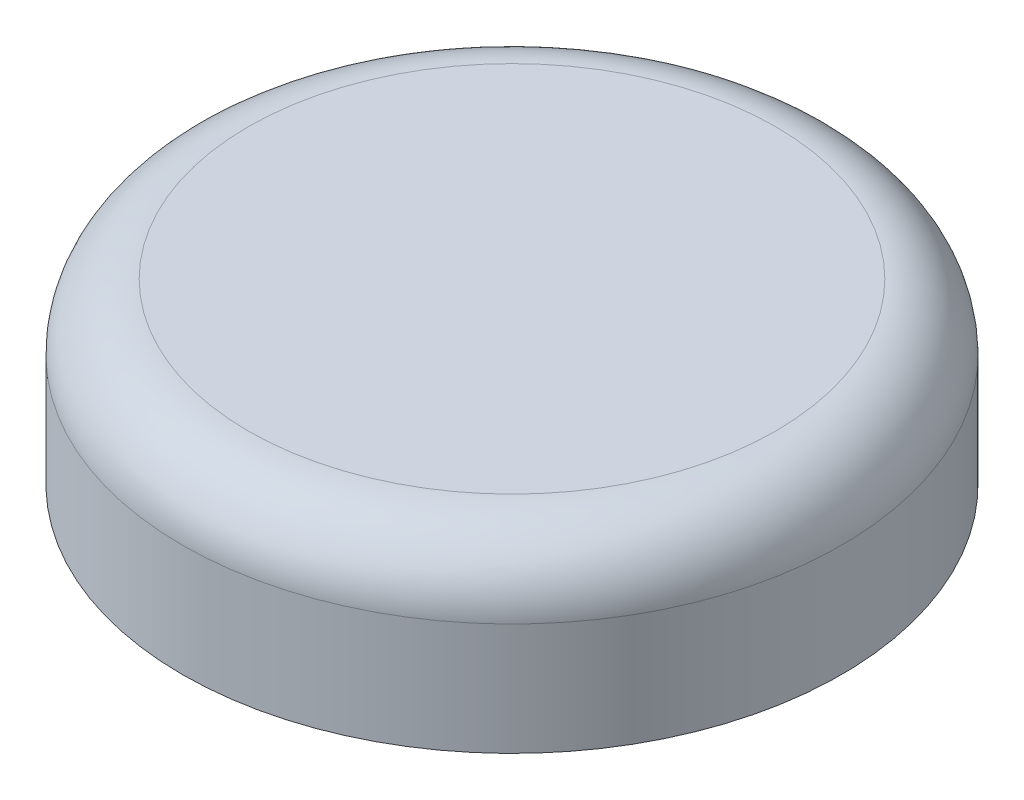
ISO-10303-21;
HEADER;
FILE_DESCRIPTION(('STEP AP214'),'2;1');
FILE_NAME('part.step','',(''),(''),'','','');
FILE_SCHEMA(('AUTOMOTIVE_DESIGN { 1 0 10303 214 1 1 1 1 }'));
ENDSEC;
DATA;
#1=APPLICATION_CONTEXT('core data for automotive mechanical design processes');
#2=APPLICATION_PROTOCOL_DEFINITION('international standard','automotive_design',2000,#1);
#3=PRODUCT_CONTEXT('',#1,'mechanical');
#4=PRODUCT('Part','Part','',(#3));
#5=PRODUCT_RELATED_PRODUCT_CATEGORY('part','',(#4));
#6=PRODUCT_DEFINITION_FORMATION('','',#4);
#7=PRODUCT_DEFINITION_CONTEXT('part definition',#1,'design');
#8=PRODUCT_DEFINITION('design','',#6,#7);
#9=PRODUCT_DEFINITION_SHAPE('','',#8);
#10=(LENGTH_UNIT() NAMED_UNIT(*) SI_UNIT(.MILLI.,.METRE.));
#11=(NAMED_UNIT(*) PLANE_ANGLE_UNIT() SI_UNIT($,.RADIAN.));
#12=(NAMED_UNIT(*) SI_UNIT($,.STERADIAN.) SOLID_ANGLE_UNIT());
#13=UNCERTAINTY_MEASURE_WITH_UNIT(LENGTH_MEASURE(1.E-05),#10,'distance_accuracy_value','');
#14=(GEOMETRIC_REPRESENTATION_CONTEXT(3) GLOBAL_UNCERTAINTY_ASSIGNED_CONTEXT((#13)) GLOBAL_UNIT_ASSIGNED_CONTEXT((#10,
#11,#12)) REPRESENTATION_CONTEXT('',''));
#15=CARTESIAN_POINT('',(0.,0.,0.));
#16=DIRECTION('',(0.,0.,1.));
#17=DIRECTION('',(1.,0.,0.));
#18=AXIS2_PLACEMENT_3D('',#15,#16,#17);
#19=CARTESIAN_POINT('',(0.,2.7,0.));
#20=DIRECTION('',(0.,-1.,0.));
#21=DIRECTION('',(0.,0.,-1.));
#22=AXIS2_PLACEMENT_3D('',#19,#20,#21);
#23=CYLINDRICAL_SURFACE('',#22,5.);
#24=CARTESIAN_POINT('',(0.,1.7,0.));
#25=DIRECTION('',(0.,1.,0.));
#26=DIRECTION('',(0.,0.,1.));
#27=AXIS2_PLACEMENT_3D('',#24,#25,#26);
#28=CIRCLE('',#27,5.);
#29=CARTESIAN_POINT('',(0.,1.7,-5.));
#30=VERTEX_POINT('',#29);
#31=EDGE_CURVE('E10',#30,#30,#28,.F.);
#32=CARTESIAN_POINT('',(0.,0.,0.));
#33=DIRECTION('',(0.,1.,0.));
#34=DIRECTION('',(0.,0.,1.));
#35=AXIS2_PLACEMENT_3D('',#32,#33,#34);
#36=CIRCLE('',#35,5.);
#37=CARTESIAN_POINT('',(0.,0.,-5.));
#38=VERTEX_POINT('',#37);
#39=EDGE_CURVE('E50',#38,#38,#36,.T.);
#40=CARTESIAN_POINT('',(0.,1.7,-5.));
#41=CARTESIAN_POINT('',(0.,1.68229166666667,-5.));
#42=CARTESIAN_POINT('',(0.,1.66458333333333,-5.));
#43=CARTESIAN_POINT('',(0.,1.62916666666667,-5.));
#44=CARTESIAN_POINT('',(0.,1.61145833333333,-5.));
#45=CARTESIAN_POINT('',(0.,1.57604166666667,-5.));
#46=CARTESIAN_POINT('',(0.,1.55833333333333,-5.));
#47=CARTESIAN_POINT('',(0.,1.52291666666667,-5.));
#48=CARTESIAN_POINT('',(0.,1.50520833333333,-5.));
#49=CARTESIAN_POINT('',(0.,1.46979166666667,-5.));
#50=CARTESIAN_POINT('',(0.,1.45208333333333,-5.));
#51=CARTESIAN_POINT('',(0.,1.41666666666667,-5.));
#52=CARTESIAN_POINT('',(0.,1.39895833333333,-5.));
#53=CARTESIAN_POINT('',(0.,1.36354166666667,-5.));
#54=CARTESIAN_POINT('',(0.,1.34583333333333,-5.));
#55=CARTESIAN_POINT('',(0.,1.31041666666667,-5.));
#56=CARTESIAN_POINT('',(0.,1.29270833333333,-5.));
#57=CARTESIAN_POINT('',(0.,1.25729166666667,-5.));
#58=CARTESIAN_POINT('',(0.,1.23958333333333,-5.));
#59=CARTESIAN_POINT('',(0.,1.20416666666667,-5.));
#60=CARTESIAN_POINT('',(0.,1.18645833333333,-5.));
#61=CARTESIAN_POINT('',(0.,1.15104166666667,-5.));
#62=CARTESIAN_POINT('',(0.,1.13333333333333,-5.));
#63=CARTESIAN_POINT('',(0.,1.09791666666667,-5.));
#64=CARTESIAN_POINT('',(0.,1.08020833333333,-5.));
#65=CARTESIAN_POINT('',(0.,1.04479166666667,-5.));
#66=CARTESIAN_POINT('',(0.,1.02708333333333,-5.));
#67=CARTESIAN_POINT('',(0.,0.991666666666666,-5.));
#68=CARTESIAN_POINT('',(0.,0.973958333333333,-5.));
#69=CARTESIAN_POINT('',(0.,0.938541666666666,-5.));
#70=CARTESIAN_POINT('',(0.,0.920833333333333,-5.));
#71=CARTESIAN_POINT('',(0.,0.885416666666666,-5.));
#72=CARTESIAN_POINT('',(0.,0.867708333333333,-5.));
#73=CARTESIAN_POINT('',(0.,0.832291666666666,-5.));
#74=CARTESIAN_POINT('',(0.,0.814583333333333,-5.));
#75=CARTESIAN_POINT('',(0.,0.779166666666666,-5.));
#76=CARTESIAN_POINT('',(0.,0.761458333333333,-5.));
#77=CARTESIAN_POINT('',(0.,0.726041666666667,-5.));
#78=CARTESIAN_POINT('',(0.,0.708333333333333,-5.));
#79=CARTESIAN_POINT('',(0.,0.672916666666666,-5.));
#80=CARTESIAN_POINT('',(0.,0.655208333333333,-5.));
#81=CARTESIAN_POINT('',(0.,0.619791666666666,-5.));
#82=CARTESIAN_POINT('',(0.,0.602083333333333,-5.));
#83=CARTESIAN_POINT('',(0.,0.566666666666667,-5.));
#84=CARTESIAN_POINT('',(0.,0.548958333333333,-5.));
#85=CARTESIAN_POINT('',(0.,0.513541666666667,-5.));
#86=CARTESIAN_POINT('',(0.,0.495833333333333,-5.));
#87=CARTESIAN_POINT('',(0.,0.460416666666666,-5.));
#88=CARTESIAN_POINT('',(0.,0.442708333333333,-5.));
#89=CARTESIAN_POINT('',(0.,0.407291666666666,-5.));
#90=CARTESIAN_POINT('',(0.,0.389583333333333,-5.));
#91=CARTESIAN_POINT('',(0.,0.354166666666666,-5.));
#92=CARTESIAN_POINT('',(0.,0.336458333333333,-5.));
#93=CARTESIAN_POINT('',(0.,0.301041666666666,-5.));
#94=CARTESIAN_POINT('',(0.,0.283333333333333,-5.));
#95=CARTESIAN_POINT('',(0.,0.247916666666666,-5.));
#96=CARTESIAN_POINT('',(0.,0.230208333333333,-5.));
#97=CARTESIAN_POINT('',(0.,0.194791666666666,-5.));
#98=CARTESIAN_POINT('',(0.,0.177083333333333,-5.));
#99=CARTESIAN_POINT('',(0.,0.141666666666666,-5.));
#100=CARTESIAN_POINT('',(0.,0.123958333333333,-5.));
#101=CARTESIAN_POINT('',(0.,0.0885416666666663,-5.));
#102=CARTESIAN_POINT('',(0.,0.0708333333333331,-5.));
#103=CARTESIAN_POINT('',(0.,0.0354166666666664,-5.));
#104=CARTESIAN_POINT('',(0.,0.0177083333333329,-5.));
#105=CARTESIAN_POINT('',(0.,0.,-5.));
#106=B_SPLINE_CURVE_WITH_KNOTS('',3,(#40,#41,#42,#43,#44,#45,#46,#47,#48,#49,#50,#51,#52,#53,
#54,#55,#56,#57,#58,#59,#60,#61,#62,#63,#64,#65,#66,#67,#68,#69,#70,#71,#72,#73,#74,#75,#76,#77,
#78,#79,#80,#81,#82,#83,#84,#85,#86,#87,#88,#89,#90,#91,#92,#93,#94,#95,#96,#97,#98,#99,#100,
#101,#102,#103,#104,#105),.UNSPECIFIED.,.F.,.F.,(4,2,2,2,2,2,2,2,2,2,2,2,2,2,2,2,2,2,2,2,2,2,2,
2,2,2,2,2,2,2,2,2,4),(0.,0.053125,0.10625,0.159375,0.2125,0.265625,0.31875,0.371875,0.425,
0.478125,0.53125,0.584375,0.6375,0.690625,0.74375,0.796875,0.85,0.903125,0.95625,1.009375,
1.0625,1.115625,1.16875,1.221875,1.275,1.328125,1.38125,1.434375,1.4875,1.540625,1.59375,
1.646875,1.7),.UNSPECIFIED.);
#107=EDGE_CURVE('BSEAM37',#30,#38,#106,.T.);
#108=ORIENTED_EDGE('',*,*,#31,.T.);
#109=ORIENTED_EDGE('',*,*,#39,.T.);
#110=ORIENTED_EDGE('',*,*,#107,.T.);
#111=ORIENTED_EDGE('',*,*,#107,.F.);
#112=EDGE_LOOP('',(#108,#110,#109,#111));
#113=FACE_BOUND('',#112,.T.);
#114=ADVANCED_FACE('F37',(#113),#23,.T.);
#115=CARTESIAN_POINT('',(0.,2.7,0.));
#116=DIRECTION('',(0.,1.,0.));
#117=DIRECTION('',(0.,0.,1.));
#118=AXIS2_PLACEMENT_3D('',#115,#116,#117);
#119=PLANE('',#118);
#120=CARTESIAN_POINT('',(0.,2.7,0.));
#121=DIRECTION('',(0.,1.,0.));
#122=DIRECTION('',(0.,0.,1.));
#123=AXIS2_PLACEMENT_3D('',#120,#121,#122);
#124=CIRCLE('',#123,4.);
#125=CARTESIAN_POINT('',(0.,2.7,4.));
#126=VERTEX_POINT('',#125);
#127=EDGE_CURVE('E45',#126,#126,#124,.T.);
#128=ORIENTED_EDGE('',*,*,#127,.T.);
#129=EDGE_LOOP('',(#128));
#130=FACE_BOUND('',#129,.T.);
#131=ADVANCED_FACE('F61',(#130),#119,.T.);
#132=CARTESIAN_POINT('',(0.,0.,0.));
#133=DIRECTION('',(0.,1.,0.));
#134=DIRECTION('',(0.,0.,1.));
#135=AXIS2_PLACEMENT_3D('',#132,#133,#134);
#136=PLANE('',#135);
#137=ORIENTED_EDGE('',*,*,#39,.F.);
#138=EDGE_LOOP('',(#137));
#139=FACE_BOUND('',#138,.T.);
#140=ADVANCED_FACE('F59',(#139),#136,.F.);
#141=CARTESIAN_POINT('',(0.,1.7,0.));
#142=DIRECTION('',(0.,1.,0.));
#143=DIRECTION('',(0.,0.,1.));
#144=AXIS2_PLACEMENT_3D('',#141,#142,#143);
#145=TOROIDAL_SURFACE('',#144,4.,1.);
#146=ORIENTED_EDGE('',*,*,#31,.F.);
#147=EDGE_LOOP('',(#146));
#148=FACE_BOUND('',#147,.T.);
#149=ORIENTED_EDGE('',*,*,#127,.F.);
#150=EDGE_LOOP('',(#149));
#151=FACE_BOUND('',#150,.T.);
#152=ADVANCED_FACE('F39',(#148,#151),#145,.T.);
#153=CLOSED_SHELL('',(#114,#131,#140,#152));
#154=MANIFOLD_SOLID_BREP('B2',#153);
#155=ADVANCED_BREP_SHAPE_REPRESENTATION('',(#18,#154),#14);
#156=SHAPE_DEFINITION_REPRESENTATION(#9,#155);
ENDSEC;
END-ISO-10303-21;
